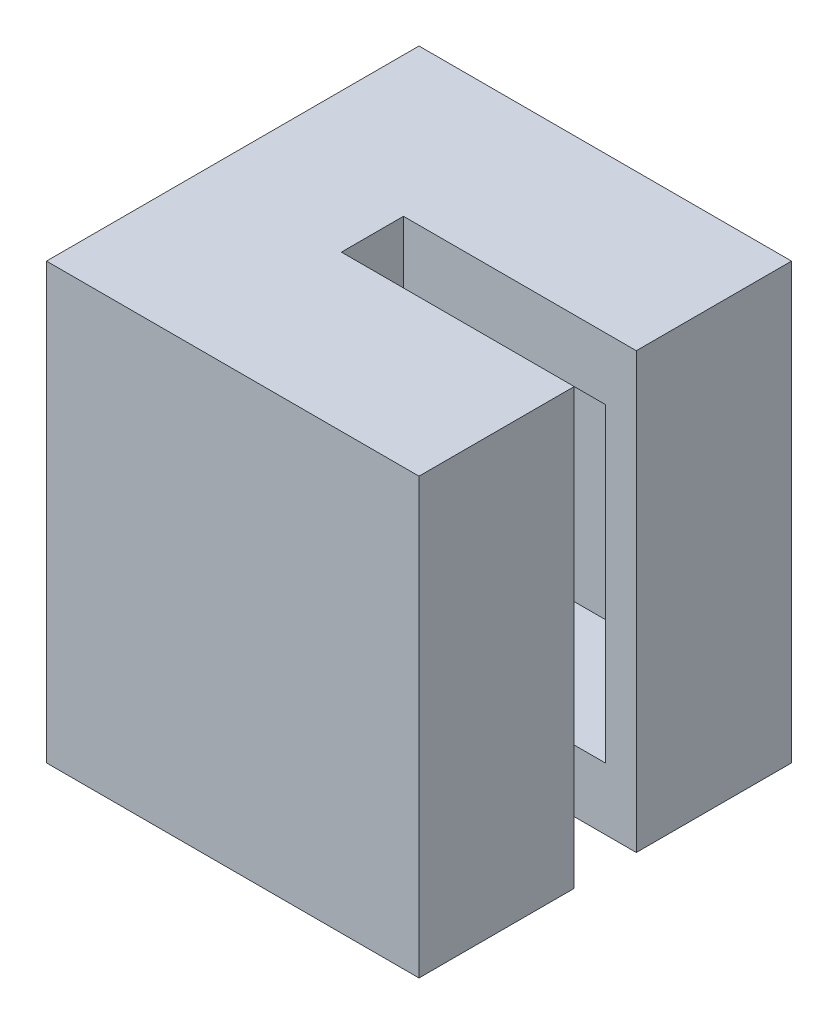
ISO-10303-21;
HEADER;
FILE_DESCRIPTION(('STEP AP214'),'2;1');
FILE_NAME('part.step','',(''),(''),'','','');
FILE_SCHEMA(('AUTOMOTIVE_DESIGN { 1 0 10303 214 1 1 1 1 }'));
ENDSEC;
DATA;
#1=APPLICATION_CONTEXT('core data for automotive mechanical design processes');
#2=APPLICATION_PROTOCOL_DEFINITION('international standard','automotive_design',2000,#1);
#3=PRODUCT_CONTEXT('',#1,'mechanical');
#4=PRODUCT('Part','Part','',(#3));
#5=PRODUCT_RELATED_PRODUCT_CATEGORY('part','',(#4));
#6=PRODUCT_DEFINITION_FORMATION('','',#4);
#7=PRODUCT_DEFINITION_CONTEXT('part definition',#1,'design');
#8=PRODUCT_DEFINITION('design','',#6,#7);
#9=PRODUCT_DEFINITION_SHAPE('','',#8);
#10=(LENGTH_UNIT() NAMED_UNIT(*) SI_UNIT(.MILLI.,.METRE.));
#11=(NAMED_UNIT(*) PLANE_ANGLE_UNIT() SI_UNIT($,.RADIAN.));
#12=(NAMED_UNIT(*) SI_UNIT($,.STERADIAN.) SOLID_ANGLE_UNIT());
#13=UNCERTAINTY_MEASURE_WITH_UNIT(LENGTH_MEASURE(1.E-05),#10,'distance_accuracy_value','');
#14=(GEOMETRIC_REPRESENTATION_CONTEXT(3) GLOBAL_UNCERTAINTY_ASSIGNED_CONTEXT((#13)) GLOBAL_UNIT_ASSIGNED_CONTEXT((#10,
#11,#12)) REPRESENTATION_CONTEXT('',''));
#15=CARTESIAN_POINT('',(0.,0.,0.));
#16=DIRECTION('',(0.,0.,1.));
#17=DIRECTION('',(1.,0.,0.));
#18=AXIS2_PLACEMENT_3D('',#15,#16,#17);
#19=CARTESIAN_POINT('',(50.,100.,50.));
#20=DIRECTION('',(-1.,0.,0.));
#21=DIRECTION('',(0.,0.,1.));
#22=AXIS2_PLACEMENT_3D('',#19,#20,#21);
#23=PLANE('',#22);
#24=DIRECTION('',(0.,-1.,0.));
#25=VECTOR('',#24,1.);
#26=CARTESIAN_POINT('',(50.,100.,-9.99999999999999));
#27=LINE('',#26,#25);
#28=CARTESIAN_POINT('',(50.,100.,-10.));
#29=VERTEX_POINT('',#28);
#30=CARTESIAN_POINT('',(50.,0.,-9.99999999999999));
#31=VERTEX_POINT('',#30);
#32=EDGE_CURVE('E209',#29,#31,#27,.T.);
#33=ORIENTED_EDGE('',*,*,#32,.F.);
#34=DIRECTION('',(0.,0.,-1.));
#35=VECTOR('',#34,1.);
#36=CARTESIAN_POINT('',(50.,100.,50.));
#37=LINE('',#36,#35);
#38=CARTESIAN_POINT('',(50.,100.,-50.));
#39=VERTEX_POINT('',#38);
#40=EDGE_CURVE('E256',#29,#39,#37,.T.);
#41=ORIENTED_EDGE('',*,*,#40,.T.);
#42=DIRECTION('',(0.,-1.,0.));
#43=VECTOR('',#42,1.);
#44=CARTESIAN_POINT('',(50.,100.,-50.));
#45=LINE('',#44,#43);
#46=CARTESIAN_POINT('',(50.,0.,-50.));
#47=VERTEX_POINT('',#46);
#48=EDGE_CURVE('E295',#39,#47,#45,.T.);
#49=ORIENTED_EDGE('',*,*,#48,.T.);
#50=DIRECTION('',(0.,0.,-1.));
#51=VECTOR('',#50,1.);
#52=CARTESIAN_POINT('',(50.,0.,50.));
#53=LINE('',#52,#51);
#54=EDGE_CURVE('E250',#31,#47,#53,.T.);
#55=ORIENTED_EDGE('',*,*,#54,.F.);
#56=EDGE_LOOP('',(#33,#41,#49,#55));
#57=FACE_BOUND('',#56,.T.);
#58=ADVANCED_FACE('F45',(#57),#23,.T.);
#59=CARTESIAN_POINT('',(0.,0.,0.));
#60=DIRECTION('',(0.,1.,0.));
#61=DIRECTION('',(0.,0.,1.));
#62=AXIS2_PLACEMENT_3D('',#59,#60,#61);
#63=PLANE('',#62);
#64=DIRECTION('',(-1.,0.,0.));
#65=VECTOR('',#64,1.);
#66=CARTESIAN_POINT('',(0.,0.,-10.));
#67=LINE('',#66,#65);
#68=CARTESIAN_POINT('',(-15.,0.,-10.));
#69=VERTEX_POINT('',#68);
#70=EDGE_CURVE('E212',#31,#69,#67,.T.);
#71=ORIENTED_EDGE('',*,*,#70,.F.);
#72=ORIENTED_EDGE('',*,*,#54,.T.);
#73=DIRECTION('',(-1.,0.,0.));
#74=VECTOR('',#73,1.);
#75=CARTESIAN_POINT('',(-50.,0.,-50.));
#76=LINE('',#75,#74);
#77=CARTESIAN_POINT('',(-50.,0.,-50.));
#78=VERTEX_POINT('',#77);
#79=EDGE_CURVE('E273',#47,#78,#76,.T.);
#80=ORIENTED_EDGE('',*,*,#79,.T.);
#81=DIRECTION('',(0.,0.,1.));
#82=VECTOR('',#81,1.);
#83=CARTESIAN_POINT('',(-50.,0.,50.));
#84=LINE('',#83,#82);
#85=CARTESIAN_POINT('',(-50.,0.,50.));
#86=VERTEX_POINT('',#85);
#87=EDGE_CURVE('E277',#78,#86,#84,.T.);
#88=ORIENTED_EDGE('',*,*,#87,.T.);
#89=DIRECTION('',(1.,0.,0.));
#90=VECTOR('',#89,1.);
#91=CARTESIAN_POINT('',(-50.,0.,50.));
#92=LINE('',#91,#90);
#93=CARTESIAN_POINT('',(50.,0.,50.));
#94=VERTEX_POINT('',#93);
#95=EDGE_CURVE('E281',#86,#94,#92,.T.);
#96=ORIENTED_EDGE('',*,*,#95,.T.);
#97=CARTESIAN_POINT('',(50.,0.,10.));
#98=VERTEX_POINT('',#97);
#99=EDGE_CURVE('E269',#94,#98,#53,.T.);
#100=ORIENTED_EDGE('',*,*,#99,.T.);
#101=DIRECTION('',(1.,0.,0.));
#102=VECTOR('',#101,1.);
#103=CARTESIAN_POINT('',(0.,0.,10.));
#104=LINE('',#103,#102);
#105=CARTESIAN_POINT('',(-15.,0.,10.));
#106=VERTEX_POINT('',#105);
#107=EDGE_CURVE('E202',#106,#98,#104,.T.);
#108=ORIENTED_EDGE('',*,*,#107,.F.);
#109=DIRECTION('',(0.,0.,1.));
#110=VECTOR('',#109,1.);
#111=CARTESIAN_POINT('',(-15.,0.,0.));
#112=LINE('',#111,#110);
#113=EDGE_CURVE('E189',#69,#106,#112,.T.);
#114=ORIENTED_EDGE('',*,*,#113,.F.);
#115=EDGE_LOOP('',(#71,#72,#80,#88,#96,#100,#108,#114));
#116=FACE_BOUND('',#115,.T.);
#117=ADVANCED_FACE('F330',(#116),#63,.T.);
#118=CARTESIAN_POINT('',(-50.,100.,-50.));
#119=DIRECTION('',(0.,0.,1.));
#120=DIRECTION('',(1.,0.,0.));
#121=AXIS2_PLACEMENT_3D('',#118,#119,#120);
#122=PLANE('',#121);
#123=ORIENTED_EDGE('',*,*,#79,.F.);
#124=ORIENTED_EDGE('',*,*,#48,.F.);
#125=DIRECTION('',(-1.,0.,0.));
#126=VECTOR('',#125,1.);
#127=CARTESIAN_POINT('',(-50.,100.,-50.));
#128=LINE('',#127,#126);
#129=CARTESIAN_POINT('',(-50.,100.,-50.));
#130=VERTEX_POINT('',#129);
#131=EDGE_CURVE('E255',#39,#130,#128,.T.);
#132=ORIENTED_EDGE('',*,*,#131,.T.);
#133=DIRECTION('',(0.,-1.,0.));
#134=VECTOR('',#133,1.);
#135=CARTESIAN_POINT('',(-50.,100.,-50.));
#136=LINE('',#135,#134);
#137=EDGE_CURVE('E292',#130,#78,#136,.T.);
#138=ORIENTED_EDGE('',*,*,#137,.T.);
#139=EDGE_LOOP('',(#123,#124,#132,#138));
#140=FACE_BOUND('',#139,.T.);
#141=ADVANCED_FACE('F351',(#140),#122,.T.);
#142=CARTESIAN_POINT('',(-50.,100.,50.));
#143=DIRECTION('',(1.,0.,0.));
#144=DIRECTION('',(0.,0.,-1.));
#145=AXIS2_PLACEMENT_3D('',#142,#143,#144);
#146=PLANE('',#145);
#147=ORIENTED_EDGE('',*,*,#87,.F.);
#148=ORIENTED_EDGE('',*,*,#137,.F.);
#149=DIRECTION('',(0.,0.,1.));
#150=VECTOR('',#149,1.);
#151=CARTESIAN_POINT('',(-50.,100.,50.));
#152=LINE('',#151,#150);
#153=CARTESIAN_POINT('',(-50.,100.,50.));
#154=VERTEX_POINT('',#153);
#155=EDGE_CURVE('E260',#130,#154,#152,.T.);
#156=ORIENTED_EDGE('',*,*,#155,.T.);
#157=DIRECTION('',(0.,-1.,0.));
#158=VECTOR('',#157,1.);
#159=CARTESIAN_POINT('',(-50.,100.,50.));
#160=LINE('',#159,#158);
#161=EDGE_CURVE('E288',#154,#86,#160,.T.);
#162=ORIENTED_EDGE('',*,*,#161,.T.);
#163=EDGE_LOOP('',(#147,#148,#156,#162));
#164=FACE_BOUND('',#163,.T.);
#165=ADVANCED_FACE('F345',(#164),#146,.T.);
#166=CARTESIAN_POINT('',(-50.,100.,50.));
#167=DIRECTION('',(0.,0.,-1.));
#168=DIRECTION('',(-1.,0.,0.));
#169=AXIS2_PLACEMENT_3D('',#166,#167,#168);
#170=PLANE('',#169);
#171=ORIENTED_EDGE('',*,*,#95,.F.);
#172=ORIENTED_EDGE('',*,*,#161,.F.);
#173=DIRECTION('',(1.,0.,0.));
#174=VECTOR('',#173,1.);
#175=CARTESIAN_POINT('',(-50.,100.,50.));
#176=LINE('',#175,#174);
#177=CARTESIAN_POINT('',(50.,100.,50.));
#178=VERTEX_POINT('',#177);
#179=EDGE_CURVE('E264',#154,#178,#176,.T.);
#180=ORIENTED_EDGE('',*,*,#179,.T.);
#181=DIRECTION('',(0.,-1.,0.));
#182=VECTOR('',#181,1.);
#183=CARTESIAN_POINT('',(50.,100.,50.));
#184=LINE('',#183,#182);
#185=EDGE_CURVE('E268',#178,#94,#184,.T.);
#186=ORIENTED_EDGE('',*,*,#185,.T.);
#187=EDGE_LOOP('',(#171,#172,#180,#186));
#188=FACE_BOUND('',#187,.T.);
#189=ADVANCED_FACE('F341',(#188),#170,.T.);
#190=DIRECTION('',(0.,1.,0.));
#191=VECTOR('',#190,1.);
#192=CARTESIAN_POINT('',(50.,100.,10.));
#193=LINE('',#192,#191);
#194=CARTESIAN_POINT('',(50.,100.,10.));
#195=VERTEX_POINT('',#194);
#196=EDGE_CURVE('E199',#98,#195,#193,.T.);
#197=ORIENTED_EDGE('',*,*,#196,.F.);
#198=ORIENTED_EDGE('',*,*,#99,.F.);
#199=ORIENTED_EDGE('',*,*,#185,.F.);
#200=EDGE_CURVE('E251',#178,#195,#37,.T.);
#201=ORIENTED_EDGE('',*,*,#200,.T.);
#202=EDGE_LOOP('',(#197,#198,#199,#201));
#203=FACE_BOUND('',#202,.T.);
#204=ADVANCED_FACE('F334',(#203),#23,.T.);
#205=CARTESIAN_POINT('',(0.,100.,0.));
#206=DIRECTION('',(0.,-1.,0.));
#207=DIRECTION('',(0.,0.,-1.));
#208=AXIS2_PLACEMENT_3D('',#205,#206,#207);
#209=PLANE('',#208);
#210=DIRECTION('',(1.,0.,0.));
#211=VECTOR('',#210,1.);
#212=CARTESIAN_POINT('',(0.,100.,-10.));
#213=LINE('',#212,#211);
#214=CARTESIAN_POINT('',(-15.,100.,-10.));
#215=VERTEX_POINT('',#214);
#216=EDGE_CURVE('E11',#215,#29,#213,.T.);
#217=ORIENTED_EDGE('',*,*,#216,.F.);
#218=DIRECTION('',(0.,0.,-1.));
#219=VECTOR('',#218,1.);
#220=CARTESIAN_POINT('',(-15.,100.,0.));
#221=LINE('',#220,#219);
#222=CARTESIAN_POINT('',(-15.,100.,10.));
#223=VERTEX_POINT('',#222);
#224=EDGE_CURVE('E312',#223,#215,#221,.T.);
#225=ORIENTED_EDGE('',*,*,#224,.F.);
#226=DIRECTION('',(-1.,0.,0.));
#227=VECTOR('',#226,1.);
#228=CARTESIAN_POINT('',(0.,100.,10.));
#229=LINE('',#228,#227);
#230=EDGE_CURVE('E54',#195,#223,#229,.T.);
#231=ORIENTED_EDGE('',*,*,#230,.F.);
#232=ORIENTED_EDGE('',*,*,#200,.F.);
#233=ORIENTED_EDGE('',*,*,#179,.F.);
#234=ORIENTED_EDGE('',*,*,#155,.F.);
#235=ORIENTED_EDGE('',*,*,#131,.F.);
#236=ORIENTED_EDGE('',*,*,#40,.F.);
#237=EDGE_LOOP('',(#217,#225,#231,#232,#233,#234,#235,#236));
#238=FACE_BOUND('',#237,.T.);
#239=ADVANCED_FACE('F338',(#238),#209,.T.);
#240=CARTESIAN_POINT('',(-15.,-30.,-10.));
#241=DIRECTION('',(0.,0.,-1.));
#242=DIRECTION('',(-1.,0.,0.));
#243=AXIS2_PLACEMENT_3D('',#240,#241,#242);
#244=PLANE('',#243);
#245=DIRECTION('',(0.,1.,0.));
#246=VECTOR('',#245,1.);
#247=CARTESIAN_POINT('',(60.,-30.,-10.));
#248=LINE('',#247,#246);
#249=CARTESIAN_POINT('',(60.,-20.,-10.));
#250=VERTEX_POINT('',#249);
#251=CARTESIAN_POINT('',(60.,120.,-10.));
#252=VERTEX_POINT('',#251);
#253=EDGE_CURVE('E186',#250,#252,#248,.T.);
#254=ORIENTED_EDGE('',*,*,#253,.T.);
#255=DIRECTION('',(-1.,0.,0.));
#256=VECTOR('',#255,1.);
#257=CARTESIAN_POINT('',(-15.,120.,-10.));
#258=LINE('',#257,#256);
#259=CARTESIAN_POINT('',(-15.,120.,-10.));
#260=VERTEX_POINT('',#259);
#261=EDGE_CURVE('E61',#252,#260,#258,.T.);
#262=ORIENTED_EDGE('',*,*,#261,.T.);
#263=DIRECTION('',(0.,1.,0.));
#264=VECTOR('',#263,1.);
#265=CARTESIAN_POINT('',(-15.,-30.,-10.));
#266=LINE('',#265,#264);
#267=EDGE_CURVE('E171',#215,#260,#266,.T.);
#268=ORIENTED_EDGE('',*,*,#267,.F.);
#269=ORIENTED_EDGE('',*,*,#216,.T.);
#270=ORIENTED_EDGE('',*,*,#32,.T.);
#271=ORIENTED_EDGE('',*,*,#70,.T.);
#272=CARTESIAN_POINT('',(-15.,-20.,-10.));
#273=VERTEX_POINT('',#272);
#274=EDGE_CURVE('E166',#273,#69,#266,.T.);
#275=ORIENTED_EDGE('',*,*,#274,.F.);
#276=DIRECTION('',(-1.,0.,0.));
#277=VECTOR('',#276,1.);
#278=CARTESIAN_POINT('',(0.,-20.,-10.));
#279=LINE('',#278,#277);
#280=EDGE_CURVE('E215',#250,#273,#279,.T.);
#281=ORIENTED_EDGE('',*,*,#280,.F.);
#282=EDGE_LOOP('',(#254,#262,#268,#269,#270,#271,#275,#281));
#283=FACE_BOUND('',#282,.T.);
#284=ADVANCED_FACE('F354',(#283),#244,.F.);
#285=CARTESIAN_POINT('',(-15.,-30.,10.));
#286=DIRECTION('',(0.,0.,1.));
#287=DIRECTION('',(1.,0.,0.));
#288=AXIS2_PLACEMENT_3D('',#285,#286,#287);
#289=PLANE('',#288);
#290=DIRECTION('',(0.,1.,0.));
#291=VECTOR('',#290,1.);
#292=CARTESIAN_POINT('',(-15.,-30.,10.));
#293=LINE('',#292,#291);
#294=CARTESIAN_POINT('',(-15.,-20.,10.));
#295=VERTEX_POINT('',#294);
#296=EDGE_CURVE('E165',#295,#106,#293,.T.);
#297=ORIENTED_EDGE('',*,*,#296,.T.);
#298=ORIENTED_EDGE('',*,*,#107,.T.);
#299=ORIENTED_EDGE('',*,*,#196,.T.);
#300=ORIENTED_EDGE('',*,*,#230,.T.);
#301=CARTESIAN_POINT('',(-15.,120.,10.));
#302=VERTEX_POINT('',#301);
#303=EDGE_CURVE('E69',#223,#302,#293,.T.);
#304=ORIENTED_EDGE('',*,*,#303,.T.);
#305=DIRECTION('',(1.,0.,0.));
#306=VECTOR('',#305,1.);
#307=CARTESIAN_POINT('',(-15.,120.,10.));
#308=LINE('',#307,#306);
#309=CARTESIAN_POINT('',(60.,120.,10.));
#310=VERTEX_POINT('',#309);
#311=EDGE_CURVE('E160',#302,#310,#308,.T.);
#312=ORIENTED_EDGE('',*,*,#311,.T.);
#313=DIRECTION('',(0.,1.,0.));
#314=VECTOR('',#313,1.);
#315=CARTESIAN_POINT('',(60.,-30.,10.));
#316=LINE('',#315,#314);
#317=CARTESIAN_POINT('',(60.,-20.,10.));
#318=VERTEX_POINT('',#317);
#319=EDGE_CURVE('E190',#318,#310,#316,.T.);
#320=ORIENTED_EDGE('',*,*,#319,.F.);
#321=DIRECTION('',(1.,0.,0.));
#322=VECTOR('',#321,1.);
#323=CARTESIAN_POINT('',(0.,-20.,10.));
#324=LINE('',#323,#322);
#325=EDGE_CURVE('E205',#295,#318,#324,.T.);
#326=ORIENTED_EDGE('',*,*,#325,.F.);
#327=EDGE_LOOP('',(#297,#298,#299,#300,#304,#312,#320,#326));
#328=FACE_BOUND('',#327,.T.);
#329=ADVANCED_FACE('F158',(#328),#289,.F.);
#330=CARTESIAN_POINT('',(-15.,-30.,10.));
#331=DIRECTION('',(-1.,0.,0.));
#332=DIRECTION('',(0.,0.,1.));
#333=AXIS2_PLACEMENT_3D('',#330,#331,#332);
#334=PLANE('',#333);
#335=ORIENTED_EDGE('',*,*,#274,.T.);
#336=ORIENTED_EDGE('',*,*,#113,.T.);
#337=ORIENTED_EDGE('',*,*,#296,.F.);
#338=DIRECTION('',(0.,0.,1.));
#339=VECTOR('',#338,1.);
#340=CARTESIAN_POINT('',(-15.,-20.,0.));
#341=LINE('',#340,#339);
#342=EDGE_CURVE('E195',#273,#295,#341,.T.);
#343=ORIENTED_EDGE('',*,*,#342,.F.);
#344=EDGE_LOOP('',(#335,#336,#337,#343));
#345=FACE_BOUND('',#344,.T.);
#346=ADVANCED_FACE('F325',(#345),#334,.F.);
#347=ORIENTED_EDGE('',*,*,#224,.T.);
#348=ORIENTED_EDGE('',*,*,#267,.T.);
#349=DIRECTION('',(0.,0.,1.));
#350=VECTOR('',#349,1.);
#351=CARTESIAN_POINT('',(-15.,120.,10.));
#352=LINE('',#351,#350);
#353=EDGE_CURVE('E169',#260,#302,#352,.T.);
#354=ORIENTED_EDGE('',*,*,#353,.T.);
#355=ORIENTED_EDGE('',*,*,#303,.F.);
#356=EDGE_LOOP('',(#347,#348,#354,#355));
#357=FACE_BOUND('',#356,.T.);
#358=ADVANCED_FACE('F170',(#357),#334,.F.);
#359=CARTESIAN_POINT('',(60.,100.,60.));
#360=DIRECTION('',(-1.,0.,0.));
#361=DIRECTION('',(0.,0.,1.));
#362=AXIS2_PLACEMENT_3D('',#359,#360,#361);
#363=PLANE('',#362);
#364=DIRECTION('',(0.,0.,-1.));
#365=VECTOR('',#364,1.);
#366=CARTESIAN_POINT('',(60.,120.,60.));
#367=LINE('',#366,#365);
#368=CARTESIAN_POINT('',(60.,120.,-60.));
#369=VERTEX_POINT('',#368);
#370=EDGE_CURVE('E219',#252,#369,#367,.T.);
#371=ORIENTED_EDGE('',*,*,#370,.F.);
#372=ORIENTED_EDGE('',*,*,#253,.F.);
#373=DIRECTION('',(0.,0.,1.));
#374=VECTOR('',#373,1.);
#375=CARTESIAN_POINT('',(60.,-20.,-60.));
#376=LINE('',#375,#374);
#377=CARTESIAN_POINT('',(60.,-20.,-60.));
#378=VERTEX_POINT('',#377);
#379=EDGE_CURVE('E234',#378,#250,#376,.T.);
#380=ORIENTED_EDGE('',*,*,#379,.F.);
#381=DIRECTION('',(0.,-1.,0.));
#382=VECTOR('',#381,1.);
#383=CARTESIAN_POINT('',(60.,100.,-60.));
#384=LINE('',#383,#382);
#385=EDGE_CURVE('E309',#369,#378,#384,.T.);
#386=ORIENTED_EDGE('',*,*,#385,.F.);
#387=EDGE_LOOP('',(#371,#372,#380,#386));
#388=FACE_BOUND('',#387,.T.);
#389=ADVANCED_FACE('F414',(#388),#363,.F.);
#390=CARTESIAN_POINT('',(60.,-20.,60.));
#391=VERTEX_POINT('',#390);
#392=EDGE_CURVE('E233',#318,#391,#376,.T.);
#393=ORIENTED_EDGE('',*,*,#392,.F.);
#394=ORIENTED_EDGE('',*,*,#319,.T.);
#395=CARTESIAN_POINT('',(60.,120.,60.));
#396=VERTEX_POINT('',#395);
#397=EDGE_CURVE('E179',#396,#310,#367,.T.);
#398=ORIENTED_EDGE('',*,*,#397,.F.);
#399=DIRECTION('',(0.,-1.,0.));
#400=VECTOR('',#399,1.);
#401=CARTESIAN_POINT('',(60.,100.,60.));
#402=LINE('',#401,#400);
#403=EDGE_CURVE('E299',#396,#391,#402,.T.);
#404=ORIENTED_EDGE('',*,*,#403,.T.);
#405=EDGE_LOOP('',(#393,#394,#398,#404));
#406=FACE_BOUND('',#405,.T.);
#407=ADVANCED_FACE('F47',(#406),#363,.F.);
#408=CARTESIAN_POINT('',(-60.,100.,-60.));
#409=DIRECTION('',(0.,0.,1.));
#410=DIRECTION('',(1.,0.,0.));
#411=AXIS2_PLACEMENT_3D('',#408,#409,#410);
#412=PLANE('',#411);
#413=ORIENTED_EDGE('',*,*,#385,.T.);
#414=DIRECTION('',(1.,0.,0.));
#415=VECTOR('',#414,1.);
#416=CARTESIAN_POINT('',(-60.,-20.,-60.));
#417=LINE('',#416,#415);
#418=CARTESIAN_POINT('',(-60.,-20.,-60.));
#419=VERTEX_POINT('',#418);
#420=EDGE_CURVE('E246',#419,#378,#417,.T.);
#421=ORIENTED_EDGE('',*,*,#420,.F.);
#422=DIRECTION('',(0.,-1.,0.));
#423=VECTOR('',#422,1.);
#424=CARTESIAN_POINT('',(-60.,100.,-60.));
#425=LINE('',#424,#423);
#426=CARTESIAN_POINT('',(-60.,120.,-60.));
#427=VERTEX_POINT('',#426);
#428=EDGE_CURVE('E306',#427,#419,#425,.T.);
#429=ORIENTED_EDGE('',*,*,#428,.F.);
#430=DIRECTION('',(-1.,0.,0.));
#431=VECTOR('',#430,1.);
#432=CARTESIAN_POINT('',(-60.,120.,-60.));
#433=LINE('',#432,#431);
#434=EDGE_CURVE('E222',#369,#427,#433,.T.);
#435=ORIENTED_EDGE('',*,*,#434,.F.);
#436=EDGE_LOOP('',(#413,#421,#429,#435));
#437=FACE_BOUND('',#436,.T.);
#438=ADVANCED_FACE('F413',(#437),#412,.F.);
#439=CARTESIAN_POINT('',(-60.,100.,60.));
#440=DIRECTION('',(1.,0.,0.));
#441=DIRECTION('',(0.,0.,-1.));
#442=AXIS2_PLACEMENT_3D('',#439,#440,#441);
#443=PLANE('',#442);
#444=ORIENTED_EDGE('',*,*,#428,.T.);
#445=DIRECTION('',(0.,0.,-1.));
#446=VECTOR('',#445,1.);
#447=CARTESIAN_POINT('',(-60.,-20.,-60.));
#448=LINE('',#447,#446);
#449=CARTESIAN_POINT('',(-60.,-20.,60.));
#450=VERTEX_POINT('',#449);
#451=EDGE_CURVE('E242',#450,#419,#448,.T.);
#452=ORIENTED_EDGE('',*,*,#451,.F.);
#453=DIRECTION('',(0.,-1.,0.));
#454=VECTOR('',#453,1.);
#455=CARTESIAN_POINT('',(-60.,100.,60.));
#456=LINE('',#455,#454);
#457=CARTESIAN_POINT('',(-60.,120.,60.));
#458=VERTEX_POINT('',#457);
#459=EDGE_CURVE('E303',#458,#450,#456,.T.);
#460=ORIENTED_EDGE('',*,*,#459,.F.);
#461=DIRECTION('',(0.,0.,1.));
#462=VECTOR('',#461,1.);
#463=CARTESIAN_POINT('',(-60.,120.,60.));
#464=LINE('',#463,#462);
#465=EDGE_CURVE('E226',#427,#458,#464,.T.);
#466=ORIENTED_EDGE('',*,*,#465,.F.);
#467=EDGE_LOOP('',(#444,#452,#460,#466));
#468=FACE_BOUND('',#467,.T.);
#469=ADVANCED_FACE('F428',(#468),#443,.F.);
#470=CARTESIAN_POINT('',(-60.,100.,60.));
#471=DIRECTION('',(0.,0.,-1.));
#472=DIRECTION('',(-1.,0.,0.));
#473=AXIS2_PLACEMENT_3D('',#470,#471,#472);
#474=PLANE('',#473);
#475=ORIENTED_EDGE('',*,*,#459,.T.);
#476=DIRECTION('',(-1.,0.,0.));
#477=VECTOR('',#476,1.);
#478=CARTESIAN_POINT('',(-60.,-20.,60.));
#479=LINE('',#478,#477);
#480=EDGE_CURVE('E238',#391,#450,#479,.T.);
#481=ORIENTED_EDGE('',*,*,#480,.F.);
#482=ORIENTED_EDGE('',*,*,#403,.F.);
#483=DIRECTION('',(1.,0.,0.));
#484=VECTOR('',#483,1.);
#485=CARTESIAN_POINT('',(-60.,120.,60.));
#486=LINE('',#485,#484);
#487=EDGE_CURVE('E230',#458,#396,#486,.T.);
#488=ORIENTED_EDGE('',*,*,#487,.F.);
#489=EDGE_LOOP('',(#475,#481,#482,#488));
#490=FACE_BOUND('',#489,.T.);
#491=ADVANCED_FACE('F392',(#490),#474,.F.);
#492=CARTESIAN_POINT('',(0.,-20.,0.));
#493=DIRECTION('',(0.,1.,0.));
#494=DIRECTION('',(0.,0.,1.));
#495=AXIS2_PLACEMENT_3D('',#492,#493,#494);
#496=PLANE('',#495);
#497=ORIENTED_EDGE('',*,*,#379,.T.);
#498=ORIENTED_EDGE('',*,*,#280,.T.);
#499=ORIENTED_EDGE('',*,*,#342,.T.);
#500=ORIENTED_EDGE('',*,*,#325,.T.);
#501=ORIENTED_EDGE('',*,*,#392,.T.);
#502=ORIENTED_EDGE('',*,*,#480,.T.);
#503=ORIENTED_EDGE('',*,*,#451,.T.);
#504=ORIENTED_EDGE('',*,*,#420,.T.);
#505=EDGE_LOOP('',(#497,#498,#499,#500,#501,#502,#503,#504));
#506=FACE_BOUND('',#505,.T.);
#507=ADVANCED_FACE('F451',(#506),#496,.F.);
#508=CARTESIAN_POINT('',(0.,120.,0.));
#509=DIRECTION('',(0.,-1.,0.));
#510=DIRECTION('',(0.,0.,-1.));
#511=AXIS2_PLACEMENT_3D('',#508,#509,#510);
#512=PLANE('',#511);
#513=ORIENTED_EDGE('',*,*,#353,.F.);
#514=ORIENTED_EDGE('',*,*,#261,.F.);
#515=ORIENTED_EDGE('',*,*,#370,.T.);
#516=ORIENTED_EDGE('',*,*,#434,.T.);
#517=ORIENTED_EDGE('',*,*,#465,.T.);
#518=ORIENTED_EDGE('',*,*,#487,.T.);
#519=ORIENTED_EDGE('',*,*,#397,.T.);
#520=ORIENTED_EDGE('',*,*,#311,.F.);
#521=EDGE_LOOP('',(#513,#514,#515,#516,#517,#518,#519,#520));
#522=FACE_BOUND('',#521,.T.);
#523=ADVANCED_FACE('F176',(#522),#512,.F.);
#524=CLOSED_SHELL('',(#58,#117,#141,#165,#189,#204,#239,#284,#329,#346,#358,#389,#407,#438,#469,
#491,#507,#523));
#525=MANIFOLD_SOLID_BREP('B2',#524);
#526=ADVANCED_BREP_SHAPE_REPRESENTATION('',(#18,#525),#14);
#527=SHAPE_DEFINITION_REPRESENTATION(#9,#526);
ENDSEC;
END-ISO-10303-21;
